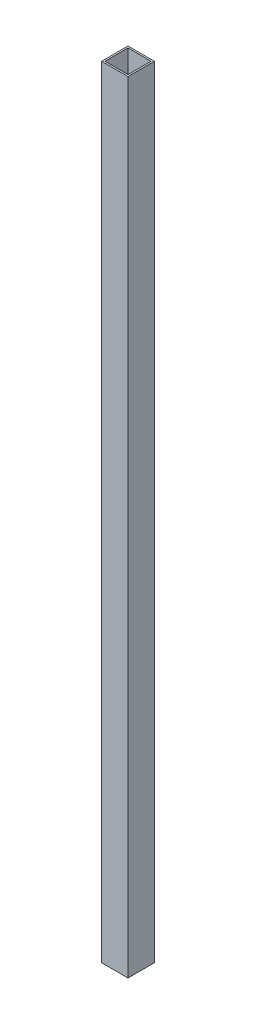
ISO-10303-21;
HEADER;
FILE_DESCRIPTION(('STEP AP214'),'2;1');
FILE_NAME('part.step','',(''),(''),'','','');
FILE_SCHEMA(('AUTOMOTIVE_DESIGN { 1 0 10303 214 1 1 1 1 }'));
ENDSEC;
DATA;
#1=APPLICATION_CONTEXT('core data for automotive mechanical design processes');
#2=APPLICATION_PROTOCOL_DEFINITION('international standard','automotive_design',2000,#1);
#3=PRODUCT_CONTEXT('',#1,'mechanical');
#4=PRODUCT('Part','Part','',(#3));
#5=PRODUCT_RELATED_PRODUCT_CATEGORY('part','',(#4));
#6=PRODUCT_DEFINITION_FORMATION('','',#4);
#7=PRODUCT_DEFINITION_CONTEXT('part definition',#1,'design');
#8=PRODUCT_DEFINITION('design','',#6,#7);
#9=PRODUCT_DEFINITION_SHAPE('','',#8);
#10=(LENGTH_UNIT() NAMED_UNIT(*) SI_UNIT(.MILLI.,.METRE.));
#11=(NAMED_UNIT(*) PLANE_ANGLE_UNIT() SI_UNIT($,.RADIAN.));
#12=(NAMED_UNIT(*) SI_UNIT($,.STERADIAN.) SOLID_ANGLE_UNIT());
#13=UNCERTAINTY_MEASURE_WITH_UNIT(LENGTH_MEASURE(1.E-05),#10,'distance_accuracy_value','');
#14=(GEOMETRIC_REPRESENTATION_CONTEXT(3) GLOBAL_UNCERTAINTY_ASSIGNED_CONTEXT((#13)) GLOBAL_UNIT_ASSIGNED_CONTEXT((#10,
#11,#12)) REPRESENTATION_CONTEXT('',''));
#15=CARTESIAN_POINT('',(0.,0.,0.));
#16=DIRECTION('',(0.,0.,1.));
#17=DIRECTION('',(1.,0.,0.));
#18=AXIS2_PLACEMENT_3D('',#15,#16,#17);
#19=CARTESIAN_POINT('',(0.,562.,0.));
#20=DIRECTION('',(0.,1.,0.));
#21=DIRECTION('',(0.,0.,1.));
#22=AXIS2_PLACEMENT_3D('',#19,#20,#21);
#23=PLANE('',#22);
#24=DIRECTION('',(0.,0.,1.));
#25=VECTOR('',#24,1.);
#26=CARTESIAN_POINT('',(0.,562.,0.));
#27=LINE('',#26,#25);
#28=CARTESIAN_POINT('',(0.,562.,0.));
#29=VERTEX_POINT('',#28);
#30=CARTESIAN_POINT('',(0.,562.,19.));
#31=VERTEX_POINT('',#30);
#32=EDGE_CURVE('E134',#29,#31,#27,.T.);
#33=ORIENTED_EDGE('',*,*,#32,.T.);
#34=DIRECTION('',(1.,0.,0.));
#35=VECTOR('',#34,1.);
#36=CARTESIAN_POINT('',(0.,562.,19.));
#37=LINE('',#36,#35);
#38=CARTESIAN_POINT('',(19.,562.,19.));
#39=VERTEX_POINT('',#38);
#40=EDGE_CURVE('E137',#31,#39,#37,.T.);
#41=ORIENTED_EDGE('',*,*,#40,.T.);
#42=DIRECTION('',(0.,0.,-1.));
#43=VECTOR('',#42,1.);
#44=CARTESIAN_POINT('',(19.,562.,0.));
#45=LINE('',#44,#43);
#46=CARTESIAN_POINT('',(19.,562.,0.));
#47=VERTEX_POINT('',#46);
#48=EDGE_CURVE('E140',#39,#47,#45,.T.);
#49=ORIENTED_EDGE('',*,*,#48,.T.);
#50=DIRECTION('',(-1.,0.,0.));
#51=VECTOR('',#50,1.);
#52=CARTESIAN_POINT('',(0.,562.,0.));
#53=LINE('',#52,#51);
#54=EDGE_CURVE('E142',#47,#29,#53,.T.);
#55=ORIENTED_EDGE('',*,*,#54,.T.);
#56=EDGE_LOOP('',(#33,#41,#49,#55));
#57=FACE_BOUND('',#56,.T.);
#58=DIRECTION('',(0.,0.,1.));
#59=VECTOR('',#58,1.);
#60=CARTESIAN_POINT('',(1.2,562.,1.2));
#61=LINE('',#60,#59);
#62=CARTESIAN_POINT('',(1.2,562.,1.2));
#63=VERTEX_POINT('',#62);
#64=CARTESIAN_POINT('',(1.2,562.,17.8));
#65=VERTEX_POINT('',#64);
#66=EDGE_CURVE('E106',#63,#65,#61,.T.);
#67=ORIENTED_EDGE('',*,*,#66,.F.);
#68=DIRECTION('',(-1.,0.,0.));
#69=VECTOR('',#68,1.);
#70=CARTESIAN_POINT('',(1.2,562.,1.2));
#71=LINE('',#70,#69);
#72=CARTESIAN_POINT('',(17.8,562.,1.2));
#73=VERTEX_POINT('',#72);
#74=EDGE_CURVE('E98',#73,#63,#71,.T.);
#75=ORIENTED_EDGE('',*,*,#74,.F.);
#76=DIRECTION('',(0.,0.,-1.));
#77=VECTOR('',#76,1.);
#78=CARTESIAN_POINT('',(17.8,562.,1.2));
#79=LINE('',#78,#77);
#80=CARTESIAN_POINT('',(17.8,562.,17.8));
#81=VERTEX_POINT('',#80);
#82=EDGE_CURVE('E120',#81,#73,#79,.T.);
#83=ORIENTED_EDGE('',*,*,#82,.F.);
#84=DIRECTION('',(1.,0.,0.));
#85=VECTOR('',#84,1.);
#86=CARTESIAN_POINT('',(1.2,562.,17.8));
#87=LINE('',#86,#85);
#88=EDGE_CURVE('E118',#65,#81,#87,.T.);
#89=ORIENTED_EDGE('',*,*,#88,.F.);
#90=EDGE_LOOP('',(#67,#75,#83,#89));
#91=FACE_BOUND('',#90,.T.);
#92=ADVANCED_FACE('F33',(#57,#91),#23,.T.);
#93=CARTESIAN_POINT('',(0.,0.,0.));
#94=DIRECTION('',(0.,1.,0.));
#95=DIRECTION('',(0.,0.,1.));
#96=AXIS2_PLACEMENT_3D('',#93,#94,#95);
#97=PLANE('',#96);
#98=DIRECTION('',(0.,0.,1.));
#99=VECTOR('',#98,1.);
#100=CARTESIAN_POINT('',(0.,0.,0.));
#101=LINE('',#100,#99);
#102=CARTESIAN_POINT('',(0.,0.,0.));
#103=VERTEX_POINT('',#102);
#104=CARTESIAN_POINT('',(0.,0.,19.));
#105=VERTEX_POINT('',#104);
#106=EDGE_CURVE('E114',#103,#105,#101,.T.);
#107=ORIENTED_EDGE('',*,*,#106,.F.);
#108=DIRECTION('',(-1.,0.,0.));
#109=VECTOR('',#108,1.);
#110=CARTESIAN_POINT('',(0.,0.,0.));
#111=LINE('',#110,#109);
#112=CARTESIAN_POINT('',(19.,0.,0.));
#113=VERTEX_POINT('',#112);
#114=EDGE_CURVE('E138',#113,#103,#111,.T.);
#115=ORIENTED_EDGE('',*,*,#114,.F.);
#116=DIRECTION('',(0.,0.,-1.));
#117=VECTOR('',#116,1.);
#118=CARTESIAN_POINT('',(19.,0.,0.));
#119=LINE('',#118,#117);
#120=CARTESIAN_POINT('',(19.,0.,19.));
#121=VERTEX_POINT('',#120);
#122=EDGE_CURVE('E149',#121,#113,#119,.T.);
#123=ORIENTED_EDGE('',*,*,#122,.F.);
#124=DIRECTION('',(1.,0.,0.));
#125=VECTOR('',#124,1.);
#126=CARTESIAN_POINT('',(0.,0.,19.));
#127=LINE('',#126,#125);
#128=EDGE_CURVE('E147',#105,#121,#127,.T.);
#129=ORIENTED_EDGE('',*,*,#128,.F.);
#130=EDGE_LOOP('',(#107,#115,#123,#129));
#131=FACE_BOUND('',#130,.T.);
#132=DIRECTION('',(-1.,0.,0.));
#133=VECTOR('',#132,1.);
#134=CARTESIAN_POINT('',(1.2,0.,1.2));
#135=LINE('',#134,#133);
#136=CARTESIAN_POINT('',(17.8,0.,1.2));
#137=VERTEX_POINT('',#136);
#138=CARTESIAN_POINT('',(1.2,0.,1.2));
#139=VERTEX_POINT('',#138);
#140=EDGE_CURVE('E56',#137,#139,#135,.T.);
#141=ORIENTED_EDGE('',*,*,#140,.T.);
#142=DIRECTION('',(0.,0.,1.));
#143=VECTOR('',#142,1.);
#144=CARTESIAN_POINT('',(1.2,0.,1.2));
#145=LINE('',#144,#143);
#146=CARTESIAN_POINT('',(1.2,0.,17.8));
#147=VERTEX_POINT('',#146);
#148=EDGE_CURVE('E113',#139,#147,#145,.T.);
#149=ORIENTED_EDGE('',*,*,#148,.T.);
#150=DIRECTION('',(1.,0.,0.));
#151=VECTOR('',#150,1.);
#152=CARTESIAN_POINT('',(1.2,0.,17.8));
#153=LINE('',#152,#151);
#154=CARTESIAN_POINT('',(17.8,0.,17.8));
#155=VERTEX_POINT('',#154);
#156=EDGE_CURVE('E126',#147,#155,#153,.T.);
#157=ORIENTED_EDGE('',*,*,#156,.T.);
#158=DIRECTION('',(0.,0.,-1.));
#159=VECTOR('',#158,1.);
#160=CARTESIAN_POINT('',(17.8,0.,1.2));
#161=LINE('',#160,#159);
#162=EDGE_CURVE('E107',#155,#137,#161,.T.);
#163=ORIENTED_EDGE('',*,*,#162,.T.);
#164=EDGE_LOOP('',(#141,#149,#157,#163));
#165=FACE_BOUND('',#164,.T.);
#166=ADVANCED_FACE('F167',(#131,#165),#97,.F.);
#167=CARTESIAN_POINT('',(0.,562.,0.));
#168=DIRECTION('',(1.,0.,0.));
#169=DIRECTION('',(0.,0.,-1.));
#170=AXIS2_PLACEMENT_3D('',#167,#168,#169);
#171=PLANE('',#170);
#172=ORIENTED_EDGE('',*,*,#106,.T.);
#173=DIRECTION('',(0.,-1.,0.));
#174=VECTOR('',#173,1.);
#175=CARTESIAN_POINT('',(0.,562.,19.));
#176=LINE('',#175,#174);
#177=EDGE_CURVE('E11',#31,#105,#176,.T.);
#178=ORIENTED_EDGE('',*,*,#177,.F.);
#179=ORIENTED_EDGE('',*,*,#32,.F.);
#180=DIRECTION('',(0.,-1.,0.));
#181=VECTOR('',#180,1.);
#182=CARTESIAN_POINT('',(0.,562.,0.));
#183=LINE('',#182,#181);
#184=EDGE_CURVE('E144',#29,#103,#183,.T.);
#185=ORIENTED_EDGE('',*,*,#184,.T.);
#186=EDGE_LOOP('',(#172,#178,#179,#185));
#187=FACE_BOUND('',#186,.T.);
#188=ADVANCED_FACE('F35',(#187),#171,.F.);
#189=CARTESIAN_POINT('',(0.,562.,19.));
#190=DIRECTION('',(0.,0.,-1.));
#191=DIRECTION('',(-1.,0.,0.));
#192=AXIS2_PLACEMENT_3D('',#189,#190,#191);
#193=PLANE('',#192);
#194=ORIENTED_EDGE('',*,*,#128,.T.);
#195=DIRECTION('',(0.,-1.,0.));
#196=VECTOR('',#195,1.);
#197=CARTESIAN_POINT('',(19.,562.,19.));
#198=LINE('',#197,#196);
#199=EDGE_CURVE('E41',#39,#121,#198,.T.);
#200=ORIENTED_EDGE('',*,*,#199,.F.);
#201=ORIENTED_EDGE('',*,*,#40,.F.);
#202=ORIENTED_EDGE('',*,*,#177,.T.);
#203=EDGE_LOOP('',(#194,#200,#201,#202));
#204=FACE_BOUND('',#203,.T.);
#205=ADVANCED_FACE('F177',(#204),#193,.F.);
#206=CARTESIAN_POINT('',(19.,562.,0.));
#207=DIRECTION('',(-1.,0.,0.));
#208=DIRECTION('',(0.,0.,1.));
#209=AXIS2_PLACEMENT_3D('',#206,#207,#208);
#210=PLANE('',#209);
#211=ORIENTED_EDGE('',*,*,#122,.T.);
#212=DIRECTION('',(0.,-1.,0.));
#213=VECTOR('',#212,1.);
#214=CARTESIAN_POINT('',(19.,562.,0.));
#215=LINE('',#214,#213);
#216=EDGE_CURVE('E154',#47,#113,#215,.T.);
#217=ORIENTED_EDGE('',*,*,#216,.F.);
#218=ORIENTED_EDGE('',*,*,#48,.F.);
#219=ORIENTED_EDGE('',*,*,#199,.T.);
#220=EDGE_LOOP('',(#211,#217,#218,#219));
#221=FACE_BOUND('',#220,.T.);
#222=ADVANCED_FACE('F161',(#221),#210,.F.);
#223=CARTESIAN_POINT('',(0.,562.,0.));
#224=DIRECTION('',(0.,0.,1.));
#225=DIRECTION('',(1.,0.,0.));
#226=AXIS2_PLACEMENT_3D('',#223,#224,#225);
#227=PLANE('',#226);
#228=ORIENTED_EDGE('',*,*,#114,.T.);
#229=ORIENTED_EDGE('',*,*,#184,.F.);
#230=ORIENTED_EDGE('',*,*,#54,.F.);
#231=ORIENTED_EDGE('',*,*,#216,.T.);
#232=EDGE_LOOP('',(#228,#229,#230,#231));
#233=FACE_BOUND('',#232,.T.);
#234=ADVANCED_FACE('F171',(#233),#227,.F.);
#235=CARTESIAN_POINT('',(1.2,562.,1.2));
#236=DIRECTION('',(0.,0.,1.));
#237=DIRECTION('',(1.,0.,0.));
#238=AXIS2_PLACEMENT_3D('',#235,#236,#237);
#239=PLANE('',#238);
#240=ORIENTED_EDGE('',*,*,#140,.F.);
#241=DIRECTION('',(0.,-1.,0.));
#242=VECTOR('',#241,1.);
#243=CARTESIAN_POINT('',(17.8,562.,1.2));
#244=LINE('',#243,#242);
#245=EDGE_CURVE('E102',#73,#137,#244,.T.);
#246=ORIENTED_EDGE('',*,*,#245,.F.);
#247=ORIENTED_EDGE('',*,*,#74,.T.);
#248=DIRECTION('',(0.,-1.,0.));
#249=VECTOR('',#248,1.);
#250=CARTESIAN_POINT('',(1.2,562.,1.2));
#251=LINE('',#250,#249);
#252=EDGE_CURVE('E101',#63,#139,#251,.T.);
#253=ORIENTED_EDGE('',*,*,#252,.T.);
#254=EDGE_LOOP('',(#240,#246,#247,#253));
#255=FACE_BOUND('',#254,.T.);
#256=ADVANCED_FACE('F100',(#255),#239,.T.);
#257=CARTESIAN_POINT('',(1.2,562.,1.2));
#258=DIRECTION('',(1.,0.,0.));
#259=DIRECTION('',(0.,0.,-1.));
#260=AXIS2_PLACEMENT_3D('',#257,#258,#259);
#261=PLANE('',#260);
#262=ORIENTED_EDGE('',*,*,#148,.F.);
#263=ORIENTED_EDGE('',*,*,#252,.F.);
#264=ORIENTED_EDGE('',*,*,#66,.T.);
#265=DIRECTION('',(0.,-1.,0.));
#266=VECTOR('',#265,1.);
#267=CARTESIAN_POINT('',(1.2,562.,17.8));
#268=LINE('',#267,#266);
#269=EDGE_CURVE('E115',#65,#147,#268,.T.);
#270=ORIENTED_EDGE('',*,*,#269,.T.);
#271=EDGE_LOOP('',(#262,#263,#264,#270));
#272=FACE_BOUND('',#271,.T.);
#273=ADVANCED_FACE('F110',(#272),#261,.T.);
#274=CARTESIAN_POINT('',(1.2,562.,17.8));
#275=DIRECTION('',(0.,0.,-1.));
#276=DIRECTION('',(-1.,0.,0.));
#277=AXIS2_PLACEMENT_3D('',#274,#275,#276);
#278=PLANE('',#277);
#279=ORIENTED_EDGE('',*,*,#156,.F.);
#280=ORIENTED_EDGE('',*,*,#269,.F.);
#281=ORIENTED_EDGE('',*,*,#88,.T.);
#282=DIRECTION('',(0.,-1.,0.));
#283=VECTOR('',#282,1.);
#284=CARTESIAN_POINT('',(17.8,562.,17.8));
#285=LINE('',#284,#283);
#286=EDGE_CURVE('E48',#81,#155,#285,.T.);
#287=ORIENTED_EDGE('',*,*,#286,.T.);
#288=EDGE_LOOP('',(#279,#280,#281,#287));
#289=FACE_BOUND('',#288,.T.);
#290=ADVANCED_FACE('F200',(#289),#278,.T.);
#291=CARTESIAN_POINT('',(17.8,562.,1.2));
#292=DIRECTION('',(-1.,0.,0.));
#293=DIRECTION('',(0.,0.,1.));
#294=AXIS2_PLACEMENT_3D('',#291,#292,#293);
#295=PLANE('',#294);
#296=ORIENTED_EDGE('',*,*,#162,.F.);
#297=ORIENTED_EDGE('',*,*,#286,.F.);
#298=ORIENTED_EDGE('',*,*,#82,.T.);
#299=ORIENTED_EDGE('',*,*,#245,.T.);
#300=EDGE_LOOP('',(#296,#297,#298,#299));
#301=FACE_BOUND('',#300,.T.);
#302=ADVANCED_FACE('F204',(#301),#295,.T.);
#303=CLOSED_SHELL('',(#92,#166,#188,#205,#222,#234,#256,#273,#290,#302));
#304=MANIFOLD_SOLID_BREP('B2',#303);
#305=ADVANCED_BREP_SHAPE_REPRESENTATION('',(#18,#304),#14);
#306=SHAPE_DEFINITION_REPRESENTATION(#9,#305);
ENDSEC;
END-ISO-10303-21;
